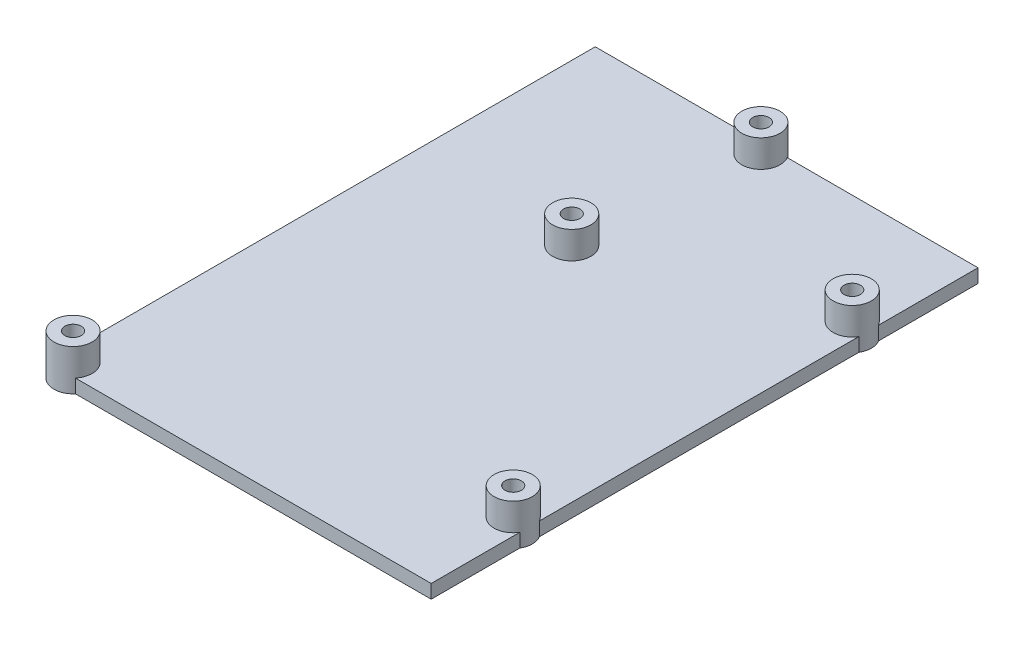
ISO-10303-21;
HEADER;
FILE_DESCRIPTION(('STEP AP214'),'2;1');
FILE_NAME('part.step','',(''),(''),'','','');
FILE_SCHEMA(('AUTOMOTIVE_DESIGN { 1 0 10303 214 1 1 1 1 }'));
ENDSEC;
DATA;
#1=APPLICATION_CONTEXT('core data for automotive mechanical design processes');
#2=APPLICATION_PROTOCOL_DEFINITION('international standard','automotive_design',2000,#1);
#3=PRODUCT_CONTEXT('',#1,'mechanical');
#4=PRODUCT('Part','Part','',(#3));
#5=PRODUCT_RELATED_PRODUCT_CATEGORY('part','',(#4));
#6=PRODUCT_DEFINITION_FORMATION('','',#4);
#7=PRODUCT_DEFINITION_CONTEXT('part definition',#1,'design');
#8=PRODUCT_DEFINITION('design','',#6,#7);
#9=PRODUCT_DEFINITION_SHAPE('','',#8);
#10=(LENGTH_UNIT() NAMED_UNIT(*) SI_UNIT(.MILLI.,.METRE.));
#11=(NAMED_UNIT(*) PLANE_ANGLE_UNIT() SI_UNIT($,.RADIAN.));
#12=(NAMED_UNIT(*) SI_UNIT($,.STERADIAN.) SOLID_ANGLE_UNIT());
#13=UNCERTAINTY_MEASURE_WITH_UNIT(LENGTH_MEASURE(1.E-05),#10,'distance_accuracy_value','');
#14=(GEOMETRIC_REPRESENTATION_CONTEXT(3) GLOBAL_UNCERTAINTY_ASSIGNED_CONTEXT((#13)) GLOBAL_UNIT_ASSIGNED_CONTEXT((#10,
#11,#12)) REPRESENTATION_CONTEXT('',''));
#15=CARTESIAN_POINT('',(0.,0.,0.));
#16=DIRECTION('',(0.,0.,1.));
#17=DIRECTION('',(1.,0.,0.));
#18=AXIS2_PLACEMENT_3D('',#15,#16,#17);
#19=CARTESIAN_POINT('',(39.,2.5,-101.5));
#20=DIRECTION('',(0.,0.,1.));
#21=DIRECTION('',(1.,0.,0.));
#22=AXIS2_PLACEMENT_3D('',#19,#20,#21);
#23=PLANE('',#22);
#24=DIRECTION('',(-1.,0.,0.));
#25=VECTOR('',#24,1.);
#26=CARTESIAN_POINT('',(39.,0.,-101.5));
#27=LINE('',#26,#25);
#28=CARTESIAN_POINT('',(109.,0.,-101.5));
#29=VERTEX_POINT('',#28);
#30=CARTESIAN_POINT('',(74.1016662039607,0.,-101.5));
#31=VERTEX_POINT('',#30);
#32=EDGE_CURVE('E138',#29,#31,#27,.T.);
#33=ORIENTED_EDGE('',*,*,#32,.T.);
#34=DIRECTION('',(0.,1.,0.));
#35=VECTOR('',#34,1.);
#36=CARTESIAN_POINT('',(74.1016662039607,-9.89949493661168,-101.5));
#37=LINE('',#36,#35);
#38=CARTESIAN_POINT('',(74.1016662039607,2.5,-101.5));
#39=VERTEX_POINT('',#38);
#40=EDGE_CURVE('E136',#31,#39,#37,.T.);
#41=ORIENTED_EDGE('',*,*,#40,.T.);
#42=DIRECTION('',(-1.,0.,0.));
#43=VECTOR('',#42,1.);
#44=CARTESIAN_POINT('',(39.,2.5,-101.5));
#45=LINE('',#44,#43);
#46=CARTESIAN_POINT('',(109.,2.5,-101.5));
#47=VERTEX_POINT('',#46);
#48=EDGE_CURVE('E122',#47,#39,#45,.T.);
#49=ORIENTED_EDGE('',*,*,#48,.F.);
#50=DIRECTION('',(0.,-1.,0.));
#51=VECTOR('',#50,1.);
#52=CARTESIAN_POINT('',(109.,2.5,-101.5));
#53=LINE('',#52,#51);
#54=EDGE_CURVE('E43',#47,#29,#53,.T.);
#55=ORIENTED_EDGE('',*,*,#54,.T.);
#56=EDGE_LOOP('',(#33,#41,#49,#55));
#57=FACE_BOUND('',#56,.T.);
#58=ADVANCED_FACE('F39',(#57),#23,.F.);
#59=CARTESIAN_POINT('',(109.,2.5,-101.5));
#60=DIRECTION('',(-1.,0.,0.));
#61=DIRECTION('',(0.,0.,1.));
#62=AXIS2_PLACEMENT_3D('',#59,#60,#61);
#63=PLANE('',#62);
#64=DIRECTION('',(0.,0.,-1.));
#65=VECTOR('',#64,1.);
#66=CARTESIAN_POINT('',(109.,0.,-101.5));
#67=LINE('',#66,#65);
#68=CARTESIAN_POINT('',(109.,0.,-21.302775637732));
#69=VERTEX_POINT('',#68);
#70=CARTESIAN_POINT('',(109.,0.,-79.697224362268));
#71=VERTEX_POINT('',#70);
#72=EDGE_CURVE('E264',#69,#71,#67,.T.);
#73=ORIENTED_EDGE('',*,*,#72,.T.);
#74=DIRECTION('',(0.,1.,0.));
#75=VECTOR('',#74,1.);
#76=CARTESIAN_POINT('',(109.,-9.89949493661168,-79.697224362268));
#77=LINE('',#76,#75);
#78=CARTESIAN_POINT('',(109.,2.5,-79.697224362268));
#79=VERTEX_POINT('',#78);
#80=EDGE_CURVE('E191',#71,#79,#77,.T.);
#81=ORIENTED_EDGE('',*,*,#80,.T.);
#82=DIRECTION('',(0.,0.,-1.));
#83=VECTOR('',#82,1.);
#84=CARTESIAN_POINT('',(109.,2.5,-101.5));
#85=LINE('',#84,#83);
#86=CARTESIAN_POINT('',(109.,2.5,-21.302775637732));
#87=VERTEX_POINT('',#86);
#88=EDGE_CURVE('E252',#87,#79,#85,.T.);
#89=ORIENTED_EDGE('',*,*,#88,.F.);
#90=DIRECTION('',(0.,1.,0.));
#91=VECTOR('',#90,1.);
#92=CARTESIAN_POINT('',(109.,-9.89949493661168,-21.302775637732));
#93=LINE('',#92,#91);
#94=EDGE_CURVE('E215',#87,#69,#93,.F.);
#95=ORIENTED_EDGE('',*,*,#94,.T.);
#96=EDGE_LOOP('',(#73,#81,#89,#95));
#97=FACE_BOUND('',#96,.T.);
#98=ADVANCED_FACE('F318',(#97),#63,.F.);
#99=CARTESIAN_POINT('',(109.,0.,-1.5));
#100=VERTEX_POINT('',#99);
#101=CARTESIAN_POINT('',(109.,0.,-17.697224362268));
#102=VERTEX_POINT('',#101);
#103=EDGE_CURVE('E260',#100,#102,#67,.T.);
#104=ORIENTED_EDGE('',*,*,#103,.T.);
#105=DIRECTION('',(0.,1.,0.));
#106=VECTOR('',#105,1.);
#107=CARTESIAN_POINT('',(109.,-9.89949493661168,-17.697224362268));
#108=LINE('',#107,#106);
#109=CARTESIAN_POINT('',(109.,2.5,-17.697224362268));
#110=VERTEX_POINT('',#109);
#111=EDGE_CURVE('E218',#102,#110,#108,.T.);
#112=ORIENTED_EDGE('',*,*,#111,.T.);
#113=CARTESIAN_POINT('',(109.,2.5,-1.5));
#114=VERTEX_POINT('',#113);
#115=EDGE_CURVE('E250',#114,#110,#85,.T.);
#116=ORIENTED_EDGE('',*,*,#115,.F.);
#117=DIRECTION('',(0.,-1.,0.));
#118=VECTOR('',#117,1.);
#119=CARTESIAN_POINT('',(109.,2.5,-1.5));
#120=LINE('',#119,#118);
#121=EDGE_CURVE('E259',#114,#100,#120,.T.);
#122=ORIENTED_EDGE('',*,*,#121,.T.);
#123=EDGE_LOOP('',(#104,#112,#116,#122));
#124=FACE_BOUND('',#123,.T.);
#125=ADVANCED_FACE('F323',(#124),#63,.F.);
#126=CARTESIAN_POINT('',(109.,2.5,-83.302775637732));
#127=VERTEX_POINT('',#126);
#128=EDGE_CURVE('E127',#127,#47,#85,.T.);
#129=ORIENTED_EDGE('',*,*,#128,.F.);
#130=DIRECTION('',(0.,1.,0.));
#131=VECTOR('',#130,1.);
#132=CARTESIAN_POINT('',(109.,-9.89949493661168,-83.302775637732));
#133=LINE('',#132,#131);
#134=CARTESIAN_POINT('',(109.,0.,-83.302775637732));
#135=VERTEX_POINT('',#134);
#136=EDGE_CURVE('E188',#127,#135,#133,.F.);
#137=ORIENTED_EDGE('',*,*,#136,.T.);
#138=EDGE_CURVE('E249',#135,#29,#67,.T.);
#139=ORIENTED_EDGE('',*,*,#138,.T.);
#140=ORIENTED_EDGE('',*,*,#54,.F.);
#141=EDGE_LOOP('',(#129,#137,#139,#140));
#142=FACE_BOUND('',#141,.T.);
#143=ADVANCED_FACE('F41',(#142),#63,.F.);
#144=CARTESIAN_POINT('',(68.0983337960392,2.5,-101.5));
#145=VERTEX_POINT('',#144);
#146=CARTESIAN_POINT('',(39.,2.5,-101.5));
#147=VERTEX_POINT('',#146);
#148=EDGE_CURVE('E133',#145,#147,#45,.T.);
#149=ORIENTED_EDGE('',*,*,#148,.F.);
#150=DIRECTION('',(0.,1.,0.));
#151=VECTOR('',#150,1.);
#152=CARTESIAN_POINT('',(68.0983337960392,-9.89949493661168,-101.5));
#153=LINE('',#152,#151);
#154=CARTESIAN_POINT('',(68.0983337960392,0.,-101.5));
#155=VERTEX_POINT('',#154);
#156=EDGE_CURVE('E63',#145,#155,#153,.F.);
#157=ORIENTED_EDGE('',*,*,#156,.T.);
#158=CARTESIAN_POINT('',(39.,0.,-101.5));
#159=VERTEX_POINT('',#158);
#160=EDGE_CURVE('E263',#155,#159,#27,.T.);
#161=ORIENTED_EDGE('',*,*,#160,.T.);
#162=DIRECTION('',(0.,-1.,0.));
#163=VECTOR('',#162,1.);
#164=CARTESIAN_POINT('',(39.,2.5,-101.5));
#165=LINE('',#164,#163);
#166=EDGE_CURVE('E275',#147,#159,#165,.T.);
#167=ORIENTED_EDGE('',*,*,#166,.F.);
#168=EDGE_LOOP('',(#149,#157,#161,#167));
#169=FACE_BOUND('',#168,.T.);
#170=ADVANCED_FACE('F319',(#169),#23,.F.);
#171=CARTESIAN_POINT('',(39.,2.5,-101.5));
#172=DIRECTION('',(1.,0.,0.));
#173=DIRECTION('',(0.,0.,-1.));
#174=AXIS2_PLACEMENT_3D('',#171,#172,#173);
#175=PLANE('',#174);
#176=DIRECTION('',(0.,0.,1.));
#177=VECTOR('',#176,1.);
#178=CARTESIAN_POINT('',(39.,0.,-101.5));
#179=LINE('',#178,#177);
#180=CARTESIAN_POINT('',(39.,0.,-6.43095132369086));
#181=VERTEX_POINT('',#180);
#182=EDGE_CURVE('E267',#159,#181,#179,.T.);
#183=ORIENTED_EDGE('',*,*,#182,.T.);
#184=DIRECTION('',(0.,1.,0.));
#185=VECTOR('',#184,1.);
#186=CARTESIAN_POINT('',(39.,-9.89949493661168,-6.43095132369086));
#187=LINE('',#186,#185);
#188=CARTESIAN_POINT('',(39.,2.5,-6.43095132369086));
#189=VERTEX_POINT('',#188);
#190=EDGE_CURVE('E245',#181,#189,#187,.T.);
#191=ORIENTED_EDGE('',*,*,#190,.T.);
#192=DIRECTION('',(0.,0.,1.));
#193=VECTOR('',#192,1.);
#194=CARTESIAN_POINT('',(39.,2.5,-101.5));
#195=LINE('',#194,#193);
#196=EDGE_CURVE('E132',#147,#189,#195,.T.);
#197=ORIENTED_EDGE('',*,*,#196,.F.);
#198=ORIENTED_EDGE('',*,*,#166,.T.);
#199=EDGE_LOOP('',(#183,#191,#197,#198));
#200=FACE_BOUND('',#199,.T.);
#201=ADVANCED_FACE('F327',(#200),#175,.F.);
#202=CARTESIAN_POINT('',(39.,2.5,-1.5));
#203=DIRECTION('',(0.,0.,-1.));
#204=DIRECTION('',(-1.,0.,0.));
#205=AXIS2_PLACEMENT_3D('',#202,#203,#204);
#206=PLANE('',#205);
#207=DIRECTION('',(1.,0.,0.));
#208=VECTOR('',#207,1.);
#209=CARTESIAN_POINT('',(39.,2.5,-1.5));
#210=LINE('',#209,#208);
#211=CARTESIAN_POINT('',(43.9309513236909,2.5,-1.5));
#212=VERTEX_POINT('',#211);
#213=EDGE_CURVE('E256',#212,#114,#210,.T.);
#214=ORIENTED_EDGE('',*,*,#213,.F.);
#215=DIRECTION('',(0.,1.,0.));
#216=VECTOR('',#215,1.);
#217=CARTESIAN_POINT('',(43.9309513236909,-9.89949493661168,-1.5));
#218=LINE('',#217,#216);
#219=CARTESIAN_POINT('',(43.9309513236909,0.,-1.5));
#220=VERTEX_POINT('',#219);
#221=EDGE_CURVE('E242',#212,#220,#218,.F.);
#222=ORIENTED_EDGE('',*,*,#221,.T.);
#223=DIRECTION('',(1.,0.,0.));
#224=VECTOR('',#223,1.);
#225=CARTESIAN_POINT('',(39.,0.,-1.5));
#226=LINE('',#225,#224);
#227=EDGE_CURVE('E270',#220,#100,#226,.T.);
#228=ORIENTED_EDGE('',*,*,#227,.T.);
#229=ORIENTED_EDGE('',*,*,#121,.F.);
#230=EDGE_LOOP('',(#214,#222,#228,#229));
#231=FACE_BOUND('',#230,.T.);
#232=ADVANCED_FACE('F332',(#231),#206,.F.);
#233=CARTESIAN_POINT('',(0.,2.5,0.));
#234=DIRECTION('',(0.,1.,0.));
#235=DIRECTION('',(0.,0.,1.));
#236=AXIS2_PLACEMENT_3D('',#233,#234,#235);
#237=PLANE('',#236);
#238=CARTESIAN_POINT('',(71.1,2.5,-99.7));
#239=DIRECTION('',(0.,1.,0.));
#240=DIRECTION('',(0.,0.,1.));
#241=AXIS2_PLACEMENT_3D('',#238,#239,#240);
#242=CIRCLE('',#241,3.50000000000001);
#243=EDGE_CURVE('E56',#145,#39,#242,.T.);
#244=ORIENTED_EDGE('',*,*,#243,.F.);
#245=ORIENTED_EDGE('',*,*,#148,.T.);
#246=ORIENTED_EDGE('',*,*,#196,.T.);
#247=CARTESIAN_POINT('',(41.25,2.5,-3.74999999999996));
#248=DIRECTION('',(0.,1.,0.));
#249=DIRECTION('',(0.,0.,1.));
#250=AXIS2_PLACEMENT_3D('',#247,#248,#249);
#251=CIRCLE('',#250,3.5);
#252=EDGE_CURVE('E238',#212,#189,#251,.T.);
#253=ORIENTED_EDGE('',*,*,#252,.F.);
#254=ORIENTED_EDGE('',*,*,#213,.T.);
#255=ORIENTED_EDGE('',*,*,#115,.T.);
#256=CARTESIAN_POINT('',(106.,2.5,-19.5));
#257=DIRECTION('',(0.,1.,0.));
#258=DIRECTION('',(0.,0.,1.));
#259=AXIS2_PLACEMENT_3D('',#256,#257,#258);
#260=CIRCLE('',#259,3.50000000000001);
#261=EDGE_CURVE('E211',#87,#110,#260,.T.);
#262=ORIENTED_EDGE('',*,*,#261,.F.);
#263=ORIENTED_EDGE('',*,*,#88,.T.);
#264=CARTESIAN_POINT('',(106.,2.5,-81.5));
#265=DIRECTION('',(0.,1.,0.));
#266=DIRECTION('',(0.,0.,1.));
#267=AXIS2_PLACEMENT_3D('',#264,#265,#266);
#268=CIRCLE('',#267,3.50000000000001);
#269=EDGE_CURVE('E184',#127,#79,#268,.T.);
#270=ORIENTED_EDGE('',*,*,#269,.F.);
#271=ORIENTED_EDGE('',*,*,#128,.T.);
#272=ORIENTED_EDGE('',*,*,#48,.T.);
#273=EDGE_LOOP('',(#244,#245,#246,#253,#254,#255,#262,#263,#270,#271,#272));
#274=FACE_BOUND('',#273,.T.);
#275=CARTESIAN_POINT('',(68.3,2.5,-67.9));
#276=DIRECTION('',(0.,1.,0.));
#277=DIRECTION('',(0.,0.,1.));
#278=AXIS2_PLACEMENT_3D('',#275,#276,#277);
#279=CIRCLE('',#278,3.50000000000001);
#280=CARTESIAN_POINT('',(68.3,2.5,-64.4));
#281=VERTEX_POINT('',#280);
#282=EDGE_CURVE('E11',#281,#281,#279,.T.);
#283=ORIENTED_EDGE('',*,*,#282,.F.);
#284=EDGE_LOOP('',(#283));
#285=FACE_BOUND('',#284,.T.);
#286=ADVANCED_FACE('F124',(#274,#285),#237,.T.);
#287=CARTESIAN_POINT('',(0.,0.,0.));
#288=DIRECTION('',(0.,1.,0.));
#289=DIRECTION('',(0.,0.,1.));
#290=AXIS2_PLACEMENT_3D('',#287,#288,#289);
#291=PLANE('',#290);
#292=ORIENTED_EDGE('',*,*,#160,.F.);
#293=CARTESIAN_POINT('',(71.1,0.,-99.7));
#294=DIRECTION('',(0.,1.,0.));
#295=DIRECTION('',(0.,0.,1.));
#296=AXIS2_PLACEMENT_3D('',#293,#294,#295);
#297=CIRCLE('',#296,3.50000000000001);
#298=EDGE_CURVE('E153',#155,#31,#297,.F.);
#299=ORIENTED_EDGE('',*,*,#298,.T.);
#300=ORIENTED_EDGE('',*,*,#32,.F.);
#301=ORIENTED_EDGE('',*,*,#138,.F.);
#302=CARTESIAN_POINT('',(106.,0.,-81.5));
#303=DIRECTION('',(0.,1.,0.));
#304=DIRECTION('',(0.,0.,1.));
#305=AXIS2_PLACEMENT_3D('',#302,#303,#304);
#306=CIRCLE('',#305,3.50000000000001);
#307=EDGE_CURVE('E176',#135,#71,#306,.F.);
#308=ORIENTED_EDGE('',*,*,#307,.T.);
#309=ORIENTED_EDGE('',*,*,#72,.F.);
#310=CARTESIAN_POINT('',(106.,0.,-19.5));
#311=DIRECTION('',(0.,1.,0.));
#312=DIRECTION('',(0.,0.,1.));
#313=AXIS2_PLACEMENT_3D('',#310,#311,#312);
#314=CIRCLE('',#313,3.50000000000001);
#315=EDGE_CURVE('E203',#69,#102,#314,.F.);
#316=ORIENTED_EDGE('',*,*,#315,.T.);
#317=ORIENTED_EDGE('',*,*,#103,.F.);
#318=ORIENTED_EDGE('',*,*,#227,.F.);
#319=CARTESIAN_POINT('',(41.25,0.,-3.74999999999996));
#320=DIRECTION('',(0.,1.,0.));
#321=DIRECTION('',(0.,0.,1.));
#322=AXIS2_PLACEMENT_3D('',#319,#320,#321);
#323=CIRCLE('',#322,3.5);
#324=EDGE_CURVE('E230',#220,#181,#323,.F.);
#325=ORIENTED_EDGE('',*,*,#324,.T.);
#326=ORIENTED_EDGE('',*,*,#182,.F.);
#327=EDGE_LOOP('',(#292,#299,#300,#301,#308,#309,#316,#317,#318,#325,#326));
#328=FACE_BOUND('',#327,.T.);
#329=ADVANCED_FACE('F289',(#328),#291,.F.);
#330=CARTESIAN_POINT('',(41.25,-9.89949493661168,-3.74999999999996));
#331=DIRECTION('',(0.,1.,0.));
#332=DIRECTION('',(0.,0.,1.));
#333=AXIS2_PLACEMENT_3D('',#330,#331,#332);
#334=CYLINDRICAL_SURFACE('',#333,3.5);
#335=CARTESIAN_POINT('',(41.25,7.5,-3.74999999999996));
#336=DIRECTION('',(0.,1.,0.));
#337=DIRECTION('',(0.,0.,1.));
#338=AXIS2_PLACEMENT_3D('',#335,#336,#337);
#339=CIRCLE('',#338,3.5);
#340=CARTESIAN_POINT('',(41.25,7.5,-0.249999999999958));
#341=VERTEX_POINT('',#340);
#342=EDGE_CURVE('E226',#341,#341,#339,.T.);
#343=ORIENTED_EDGE('',*,*,#342,.F.);
#344=EDGE_LOOP('',(#343));
#345=FACE_BOUND('',#344,.T.);
#346=ORIENTED_EDGE('',*,*,#190,.F.);
#347=ORIENTED_EDGE('',*,*,#324,.F.);
#348=ORIENTED_EDGE('',*,*,#221,.F.);
#349=ORIENTED_EDGE('',*,*,#252,.T.);
#350=EDGE_LOOP('',(#346,#347,#348,#349));
#351=FACE_BOUND('',#350,.T.);
#352=ADVANCED_FACE('F359',(#345,#351),#334,.T.);
#353=CARTESIAN_POINT('',(41.25,-9.89949493661168,-3.74999999999996));
#354=DIRECTION('',(0.,1.,0.));
#355=DIRECTION('',(0.,0.,1.));
#356=AXIS2_PLACEMENT_3D('',#353,#354,#355);
#357=CYLINDRICAL_SURFACE('',#356,1.5);
#358=CARTESIAN_POINT('',(41.25,2.5,-3.74999999999996));
#359=DIRECTION('',(0.,1.,0.));
#360=DIRECTION('',(0.,0.,1.));
#361=AXIS2_PLACEMENT_3D('',#358,#359,#360);
#362=CIRCLE('',#361,1.5);
#363=CARTESIAN_POINT('',(41.25,2.5,-2.24999999999995));
#364=VERTEX_POINT('',#363);
#365=EDGE_CURVE('E234',#364,#364,#362,.T.);
#366=ORIENTED_EDGE('',*,*,#365,.F.);
#367=EDGE_LOOP('',(#366));
#368=FACE_BOUND('',#367,.T.);
#369=CARTESIAN_POINT('',(41.25,7.5,-3.74999999999996));
#370=DIRECTION('',(0.,1.,0.));
#371=DIRECTION('',(0.,0.,1.));
#372=AXIS2_PLACEMENT_3D('',#369,#370,#371);
#373=CIRCLE('',#372,1.5);
#374=CARTESIAN_POINT('',(41.25,7.5,-2.24999999999995));
#375=VERTEX_POINT('',#374);
#376=EDGE_CURVE('E222',#375,#375,#373,.T.);
#377=ORIENTED_EDGE('',*,*,#376,.T.);
#378=EDGE_LOOP('',(#377));
#379=FACE_BOUND('',#378,.T.);
#380=ADVANCED_FACE('F361',(#368,#379),#357,.F.);
#381=CARTESIAN_POINT('',(41.25,7.5,-3.74999999999996));
#382=DIRECTION('',(0.,1.,0.));
#383=DIRECTION('',(0.,0.,1.));
#384=AXIS2_PLACEMENT_3D('',#381,#382,#383);
#385=PLANE('',#384);
#386=ORIENTED_EDGE('',*,*,#342,.T.);
#387=EDGE_LOOP('',(#386));
#388=FACE_BOUND('',#387,.T.);
#389=ORIENTED_EDGE('',*,*,#376,.F.);
#390=EDGE_LOOP('',(#389));
#391=FACE_BOUND('',#390,.T.);
#392=ADVANCED_FACE('F368',(#388,#391),#385,.T.);
#393=ORIENTED_EDGE('',*,*,#365,.T.);
#394=EDGE_LOOP('',(#393));
#395=FACE_BOUND('',#394,.T.);
#396=ADVANCED_FACE('F375',(#395),#237,.T.);
#397=CARTESIAN_POINT('',(106.,-9.89949493661168,-19.5));
#398=DIRECTION('',(0.,1.,0.));
#399=DIRECTION('',(0.,0.,1.));
#400=AXIS2_PLACEMENT_3D('',#397,#398,#399);
#401=CYLINDRICAL_SURFACE('',#400,3.50000000000001);
#402=CARTESIAN_POINT('',(106.,7.5,-19.5));
#403=DIRECTION('',(0.,1.,0.));
#404=DIRECTION('',(0.,0.,1.));
#405=AXIS2_PLACEMENT_3D('',#402,#403,#404);
#406=CIRCLE('',#405,3.50000000000001);
#407=CARTESIAN_POINT('',(106.,7.5,-16.));
#408=VERTEX_POINT('',#407);
#409=EDGE_CURVE('E199',#408,#408,#406,.T.);
#410=ORIENTED_EDGE('',*,*,#409,.F.);
#411=EDGE_LOOP('',(#410));
#412=FACE_BOUND('',#411,.T.);
#413=ORIENTED_EDGE('',*,*,#111,.F.);
#414=ORIENTED_EDGE('',*,*,#315,.F.);
#415=ORIENTED_EDGE('',*,*,#94,.F.);
#416=ORIENTED_EDGE('',*,*,#261,.T.);
#417=EDGE_LOOP('',(#413,#414,#415,#416));
#418=FACE_BOUND('',#417,.T.);
#419=ADVANCED_FACE('F347',(#412,#418),#401,.T.);
#420=CARTESIAN_POINT('',(106.,-9.89949493661168,-19.5));
#421=DIRECTION('',(0.,1.,0.));
#422=DIRECTION('',(0.,0.,1.));
#423=AXIS2_PLACEMENT_3D('',#420,#421,#422);
#424=CYLINDRICAL_SURFACE('',#423,1.5);
#425=CARTESIAN_POINT('',(106.,2.5,-19.5));
#426=DIRECTION('',(0.,1.,0.));
#427=DIRECTION('',(0.,0.,1.));
#428=AXIS2_PLACEMENT_3D('',#425,#426,#427);
#429=CIRCLE('',#428,1.5);
#430=CARTESIAN_POINT('',(106.,2.5,-18.));
#431=VERTEX_POINT('',#430);
#432=EDGE_CURVE('E207',#431,#431,#429,.T.);
#433=ORIENTED_EDGE('',*,*,#432,.F.);
#434=EDGE_LOOP('',(#433));
#435=FACE_BOUND('',#434,.T.);
#436=CARTESIAN_POINT('',(106.,7.5,-19.5));
#437=DIRECTION('',(0.,1.,0.));
#438=DIRECTION('',(0.,0.,1.));
#439=AXIS2_PLACEMENT_3D('',#436,#437,#438);
#440=CIRCLE('',#439,1.5);
#441=CARTESIAN_POINT('',(106.,7.5,-18.));
#442=VERTEX_POINT('',#441);
#443=EDGE_CURVE('E195',#442,#442,#440,.T.);
#444=ORIENTED_EDGE('',*,*,#443,.T.);
#445=EDGE_LOOP('',(#444));
#446=FACE_BOUND('',#445,.T.);
#447=ADVANCED_FACE('F429',(#435,#446),#424,.F.);
#448=CARTESIAN_POINT('',(106.,7.5,-19.5));
#449=DIRECTION('',(0.,1.,0.));
#450=DIRECTION('',(0.,0.,1.));
#451=AXIS2_PLACEMENT_3D('',#448,#449,#450);
#452=PLANE('',#451);
#453=ORIENTED_EDGE('',*,*,#409,.T.);
#454=EDGE_LOOP('',(#453));
#455=FACE_BOUND('',#454,.T.);
#456=ORIENTED_EDGE('',*,*,#443,.F.);
#457=EDGE_LOOP('',(#456));
#458=FACE_BOUND('',#457,.T.);
#459=ADVANCED_FACE('F439',(#455,#458),#452,.T.);
#460=ORIENTED_EDGE('',*,*,#432,.T.);
#461=EDGE_LOOP('',(#460));
#462=FACE_BOUND('',#461,.T.);
#463=ADVANCED_FACE('F420',(#462),#237,.T.);
#464=CARTESIAN_POINT('',(106.,-9.89949493661168,-81.5));
#465=DIRECTION('',(0.,1.,0.));
#466=DIRECTION('',(0.,0.,1.));
#467=AXIS2_PLACEMENT_3D('',#464,#465,#466);
#468=CYLINDRICAL_SURFACE('',#467,3.50000000000001);
#469=CARTESIAN_POINT('',(106.,7.5,-81.5));
#470=DIRECTION('',(0.,1.,0.));
#471=DIRECTION('',(0.,0.,1.));
#472=AXIS2_PLACEMENT_3D('',#469,#470,#471);
#473=CIRCLE('',#472,3.50000000000001);
#474=CARTESIAN_POINT('',(106.,7.5,-78.));
#475=VERTEX_POINT('',#474);
#476=EDGE_CURVE('E172',#475,#475,#473,.T.);
#477=ORIENTED_EDGE('',*,*,#476,.F.);
#478=EDGE_LOOP('',(#477));
#479=FACE_BOUND('',#478,.T.);
#480=ORIENTED_EDGE('',*,*,#80,.F.);
#481=ORIENTED_EDGE('',*,*,#307,.F.);
#482=ORIENTED_EDGE('',*,*,#136,.F.);
#483=ORIENTED_EDGE('',*,*,#269,.T.);
#484=EDGE_LOOP('',(#480,#481,#482,#483));
#485=FACE_BOUND('',#484,.T.);
#486=ADVANCED_FACE('F344',(#479,#485),#468,.T.);
#487=CARTESIAN_POINT('',(106.,-9.89949493661168,-81.5));
#488=DIRECTION('',(0.,1.,0.));
#489=DIRECTION('',(0.,0.,1.));
#490=AXIS2_PLACEMENT_3D('',#487,#488,#489);
#491=CYLINDRICAL_SURFACE('',#490,1.5);
#492=CARTESIAN_POINT('',(106.,2.5,-81.5));
#493=DIRECTION('',(0.,1.,0.));
#494=DIRECTION('',(0.,0.,1.));
#495=AXIS2_PLACEMENT_3D('',#492,#493,#494);
#496=CIRCLE('',#495,1.5);
#497=CARTESIAN_POINT('',(106.,2.5,-80.));
#498=VERTEX_POINT('',#497);
#499=EDGE_CURVE('E180',#498,#498,#496,.T.);
#500=ORIENTED_EDGE('',*,*,#499,.F.);
#501=EDGE_LOOP('',(#500));
#502=FACE_BOUND('',#501,.T.);
#503=CARTESIAN_POINT('',(106.,7.5,-81.5));
#504=DIRECTION('',(0.,1.,0.));
#505=DIRECTION('',(0.,0.,1.));
#506=AXIS2_PLACEMENT_3D('',#503,#504,#505);
#507=CIRCLE('',#506,1.5);
#508=CARTESIAN_POINT('',(106.,7.5,-80.));
#509=VERTEX_POINT('',#508);
#510=EDGE_CURVE('E167',#509,#509,#507,.T.);
#511=ORIENTED_EDGE('',*,*,#510,.T.);
#512=EDGE_LOOP('',(#511));
#513=FACE_BOUND('',#512,.T.);
#514=ADVANCED_FACE('F467',(#502,#513),#491,.F.);
#515=CARTESIAN_POINT('',(106.,7.5,-81.5));
#516=DIRECTION('',(0.,1.,0.));
#517=DIRECTION('',(0.,0.,1.));
#518=AXIS2_PLACEMENT_3D('',#515,#516,#517);
#519=PLANE('',#518);
#520=ORIENTED_EDGE('',*,*,#476,.T.);
#521=EDGE_LOOP('',(#520));
#522=FACE_BOUND('',#521,.T.);
#523=ORIENTED_EDGE('',*,*,#510,.F.);
#524=EDGE_LOOP('',(#523));
#525=FACE_BOUND('',#524,.T.);
#526=ADVANCED_FACE('F477',(#522,#525),#519,.T.);
#527=ORIENTED_EDGE('',*,*,#499,.T.);
#528=EDGE_LOOP('',(#527));
#529=FACE_BOUND('',#528,.T.);
#530=ADVANCED_FACE('F459',(#529),#237,.T.);
#531=CARTESIAN_POINT('',(68.3,-9.89949493661168,-67.9));
#532=DIRECTION('',(0.,1.,0.));
#533=DIRECTION('',(0.,0.,1.));
#534=AXIS2_PLACEMENT_3D('',#531,#532,#533);
#535=CYLINDRICAL_SURFACE('',#534,3.50000000000001);
#536=ORIENTED_EDGE('',*,*,#282,.T.);
#537=EDGE_LOOP('',(#536));
#538=FACE_BOUND('',#537,.T.);
#539=CARTESIAN_POINT('',(68.3,7.5,-67.9));
#540=DIRECTION('',(0.,1.,0.));
#541=DIRECTION('',(0.,0.,1.));
#542=AXIS2_PLACEMENT_3D('',#539,#540,#541);
#543=CIRCLE('',#542,3.50000000000001);
#544=CARTESIAN_POINT('',(68.3,7.5,-64.4));
#545=VERTEX_POINT('',#544);
#546=EDGE_CURVE('E160',#545,#545,#543,.T.);
#547=ORIENTED_EDGE('',*,*,#546,.F.);
#548=EDGE_LOOP('',(#547));
#549=FACE_BOUND('',#548,.T.);
#550=ADVANCED_FACE('F497',(#538,#549),#535,.T.);
#551=CARTESIAN_POINT('',(68.3,-9.89949493661168,-67.9));
#552=DIRECTION('',(0.,1.,0.));
#553=DIRECTION('',(0.,0.,1.));
#554=AXIS2_PLACEMENT_3D('',#551,#552,#553);
#555=CYLINDRICAL_SURFACE('',#554,1.5);
#556=CARTESIAN_POINT('',(68.3,2.5,-67.9));
#557=DIRECTION('',(0.,1.,0.));
#558=DIRECTION('',(0.,0.,1.));
#559=AXIS2_PLACEMENT_3D('',#556,#557,#558);
#560=CIRCLE('',#559,1.5);
#561=CARTESIAN_POINT('',(68.3,2.5,-66.4));
#562=VERTEX_POINT('',#561);
#563=EDGE_CURVE('E164',#562,#562,#560,.T.);
#564=ORIENTED_EDGE('',*,*,#563,.F.);
#565=EDGE_LOOP('',(#564));
#566=FACE_BOUND('',#565,.T.);
#567=CARTESIAN_POINT('',(68.3,7.5,-67.9));
#568=DIRECTION('',(0.,1.,0.));
#569=DIRECTION('',(0.,0.,1.));
#570=AXIS2_PLACEMENT_3D('',#567,#568,#569);
#571=CIRCLE('',#570,1.5);
#572=CARTESIAN_POINT('',(68.3,7.5,-66.4));
#573=VERTEX_POINT('',#572);
#574=EDGE_CURVE('E143',#573,#573,#571,.T.);
#575=ORIENTED_EDGE('',*,*,#574,.T.);
#576=EDGE_LOOP('',(#575));
#577=FACE_BOUND('',#576,.T.);
#578=ADVANCED_FACE('F506',(#566,#577),#555,.F.);
#579=CARTESIAN_POINT('',(68.3,7.5,-67.9));
#580=DIRECTION('',(0.,1.,0.));
#581=DIRECTION('',(0.,0.,1.));
#582=AXIS2_PLACEMENT_3D('',#579,#580,#581);
#583=PLANE('',#582);
#584=ORIENTED_EDGE('',*,*,#546,.T.);
#585=EDGE_LOOP('',(#584));
#586=FACE_BOUND('',#585,.T.);
#587=ORIENTED_EDGE('',*,*,#574,.F.);
#588=EDGE_LOOP('',(#587));
#589=FACE_BOUND('',#588,.T.);
#590=ADVANCED_FACE('F516',(#586,#589),#583,.T.);
#591=ORIENTED_EDGE('',*,*,#563,.T.);
#592=EDGE_LOOP('',(#591));
#593=FACE_BOUND('',#592,.T.);
#594=ADVANCED_FACE('F314',(#593),#237,.T.);
#595=CARTESIAN_POINT('',(71.1,-9.89949493661168,-99.7));
#596=DIRECTION('',(0.,1.,0.));
#597=DIRECTION('',(0.,0.,1.));
#598=AXIS2_PLACEMENT_3D('',#595,#596,#597);
#599=CYLINDRICAL_SURFACE('',#598,3.50000000000001);
#600=CARTESIAN_POINT('',(71.1,7.5,-99.7));
#601=DIRECTION('',(0.,1.,0.));
#602=DIRECTION('',(0.,0.,1.));
#603=AXIS2_PLACEMENT_3D('',#600,#601,#602);
#604=CIRCLE('',#603,3.50000000000001);
#605=CARTESIAN_POINT('',(71.1,7.5,-96.2));
#606=VERTEX_POINT('',#605);
#607=EDGE_CURVE('E291',#606,#606,#604,.T.);
#608=ORIENTED_EDGE('',*,*,#607,.F.);
#609=EDGE_LOOP('',(#608));
#610=FACE_BOUND('',#609,.T.);
#611=ORIENTED_EDGE('',*,*,#40,.F.);
#612=ORIENTED_EDGE('',*,*,#298,.F.);
#613=ORIENTED_EDGE('',*,*,#156,.F.);
#614=ORIENTED_EDGE('',*,*,#243,.T.);
#615=EDGE_LOOP('',(#611,#612,#613,#614));
#616=FACE_BOUND('',#615,.T.);
#617=ADVANCED_FACE('F145',(#610,#616),#599,.T.);
#618=CARTESIAN_POINT('',(71.1,-9.89949493661168,-99.7));
#619=DIRECTION('',(0.,1.,0.));
#620=DIRECTION('',(0.,0.,1.));
#621=AXIS2_PLACEMENT_3D('',#618,#619,#620);
#622=CYLINDRICAL_SURFACE('',#621,1.5);
#623=CARTESIAN_POINT('',(71.1,2.5,-99.7));
#624=DIRECTION('',(0.,1.,0.));
#625=DIRECTION('',(0.,0.,1.));
#626=AXIS2_PLACEMENT_3D('',#623,#624,#625);
#627=CIRCLE('',#626,1.5);
#628=CARTESIAN_POINT('',(71.1,2.5,-98.2));
#629=VERTEX_POINT('',#628);
#630=EDGE_CURVE('E147',#629,#629,#627,.T.);
#631=ORIENTED_EDGE('',*,*,#630,.F.);
#632=EDGE_LOOP('',(#631));
#633=FACE_BOUND('',#632,.T.);
#634=CARTESIAN_POINT('',(71.1,7.5,-99.7));
#635=DIRECTION('',(0.,1.,0.));
#636=DIRECTION('',(0.,0.,1.));
#637=AXIS2_PLACEMENT_3D('',#634,#635,#636);
#638=CIRCLE('',#637,1.5);
#639=CARTESIAN_POINT('',(71.1,7.5,-98.2));
#640=VERTEX_POINT('',#639);
#641=EDGE_CURVE('E294',#640,#640,#638,.T.);
#642=ORIENTED_EDGE('',*,*,#641,.T.);
#643=EDGE_LOOP('',(#642));
#644=FACE_BOUND('',#643,.T.);
#645=ADVANCED_FACE('F301',(#633,#644),#622,.F.);
#646=CARTESIAN_POINT('',(71.1,7.5,-99.7));
#647=DIRECTION('',(0.,1.,0.));
#648=DIRECTION('',(0.,0.,1.));
#649=AXIS2_PLACEMENT_3D('',#646,#647,#648);
#650=PLANE('',#649);
#651=ORIENTED_EDGE('',*,*,#607,.T.);
#652=EDGE_LOOP('',(#651));
#653=FACE_BOUND('',#652,.T.);
#654=ORIENTED_EDGE('',*,*,#641,.F.);
#655=EDGE_LOOP('',(#654));
#656=FACE_BOUND('',#655,.T.);
#657=ADVANCED_FACE('F303',(#653,#656),#650,.T.);
#658=ORIENTED_EDGE('',*,*,#630,.T.);
#659=EDGE_LOOP('',(#658));
#660=FACE_BOUND('',#659,.T.);
#661=ADVANCED_FACE('F305',(#660),#237,.T.);
#662=CLOSED_SHELL('',(#58,#98,#125,#143,#170,#201,#232,#286,#329,#352,#380,#392,#396,#419,#447,
#459,#463,#486,#514,#526,#530,#550,#578,#590,#594,#617,#645,#657,#661));
#663=MANIFOLD_SOLID_BREP('B2',#662);
#664=ADVANCED_BREP_SHAPE_REPRESENTATION('',(#18,#663),#14);
#665=SHAPE_DEFINITION_REPRESENTATION(#9,#664);
ENDSEC;
END-ISO-10303-21;
